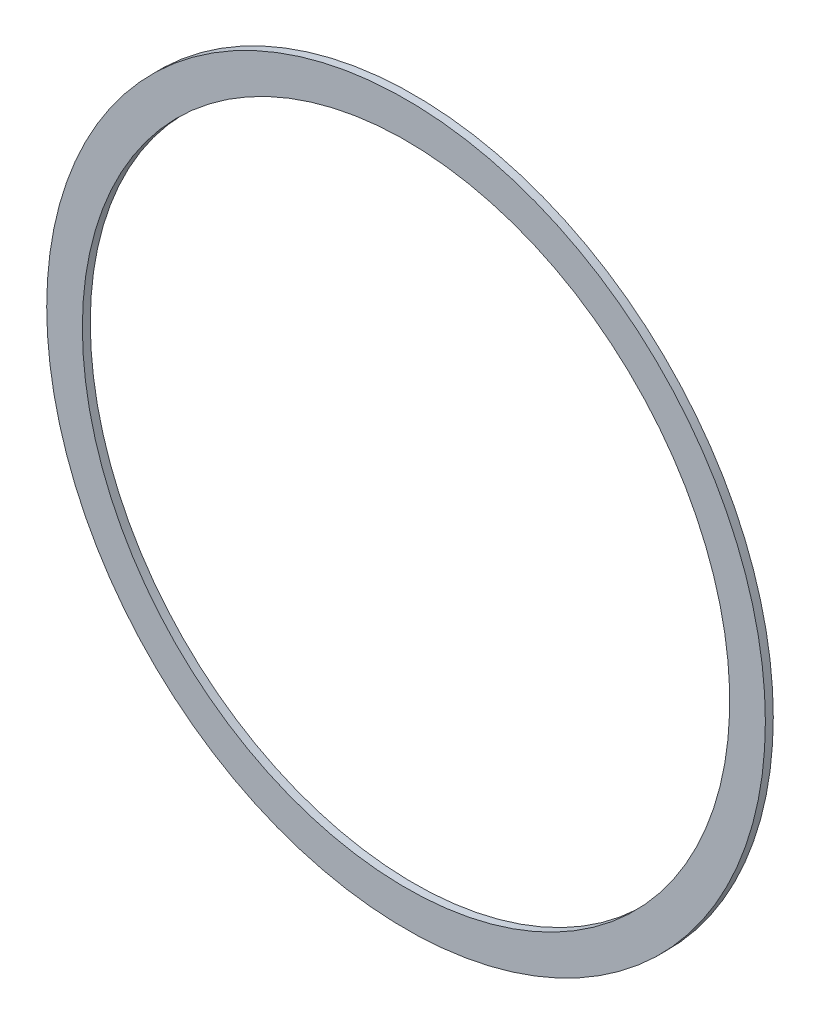
ISO-10303-21;
HEADER;
FILE_DESCRIPTION(('STEP AP214'),'2;1');
FILE_NAME('part.step','',(''),(''),'','','');
FILE_SCHEMA(('AUTOMOTIVE_DESIGN { 1 0 10303 214 1 1 1 1 }'));
ENDSEC;
DATA;
#1=APPLICATION_CONTEXT('core data for automotive mechanical design processes');
#2=APPLICATION_PROTOCOL_DEFINITION('international standard','automotive_design',2000,#1);
#3=PRODUCT_CONTEXT('',#1,'mechanical');
#4=PRODUCT('Part','Part','',(#3));
#5=PRODUCT_RELATED_PRODUCT_CATEGORY('part','',(#4));
#6=PRODUCT_DEFINITION_FORMATION('','',#4);
#7=PRODUCT_DEFINITION_CONTEXT('part definition',#1,'design');
#8=PRODUCT_DEFINITION('design','',#6,#7);
#9=PRODUCT_DEFINITION_SHAPE('','',#8);
#10=(LENGTH_UNIT() NAMED_UNIT(*) SI_UNIT(.MILLI.,.METRE.));
#11=(NAMED_UNIT(*) PLANE_ANGLE_UNIT() SI_UNIT($,.RADIAN.));
#12=(NAMED_UNIT(*) SI_UNIT($,.STERADIAN.) SOLID_ANGLE_UNIT());
#13=UNCERTAINTY_MEASURE_WITH_UNIT(LENGTH_MEASURE(1.E-05),#10,'distance_accuracy_value','');
#14=(GEOMETRIC_REPRESENTATION_CONTEXT(3) GLOBAL_UNCERTAINTY_ASSIGNED_CONTEXT((#13)) GLOBAL_UNIT_ASSIGNED_CONTEXT((#10,
#11,#12)) REPRESENTATION_CONTEXT('',''));
#15=CARTESIAN_POINT('',(0.,0.,0.));
#16=DIRECTION('',(0.,0.,1.));
#17=DIRECTION('',(1.,0.,0.));
#18=AXIS2_PLACEMENT_3D('',#15,#16,#17);
#19=CARTESIAN_POINT('',(0.,0.,-0.175));
#20=DIRECTION('',(0.,0.,1.));
#21=DIRECTION('',(1.,0.,0.));
#22=AXIS2_PLACEMENT_3D('',#19,#20,#21);
#23=PLANE('',#22);
#24=CARTESIAN_POINT('',(0.,0.,-0.175));
#25=DIRECTION('',(0.,0.,-1.));
#26=DIRECTION('',(-1.,0.,0.));
#27=AXIS2_PLACEMENT_3D('',#24,#25,#26);
#28=CIRCLE('',#27,14.3002);
#29=CARTESIAN_POINT('',(-14.3002,0.,-0.175));
#30=VERTEX_POINT('',#29);
#31=EDGE_CURVE('E27',#30,#30,#28,.F.);
#32=ORIENTED_EDGE('',*,*,#31,.T.);
#33=EDGE_LOOP('',(#32));
#34=FACE_BOUND('',#33,.T.);
#35=CARTESIAN_POINT('',(0.,0.,-0.175));
#36=DIRECTION('',(0.,0.,-1.));
#37=DIRECTION('',(-1.,0.,0.));
#38=AXIS2_PLACEMENT_3D('',#35,#36,#37);
#39=CIRCLE('',#38,15.875);
#40=CARTESIAN_POINT('',(-15.875,0.,-0.175));
#41=VERTEX_POINT('',#40);
#42=EDGE_CURVE('E18',#41,#41,#39,.F.);
#43=ORIENTED_EDGE('',*,*,#42,.F.);
#44=EDGE_LOOP('',(#43));
#45=FACE_BOUND('',#44,.T.);
#46=ADVANCED_FACE('F15',(#34,#45),#23,.F.);
#47=CARTESIAN_POINT('',(0.,0.,0.175));
#48=DIRECTION('',(0.,0.,-1.));
#49=DIRECTION('',(-1.,0.,0.));
#50=AXIS2_PLACEMENT_3D('',#47,#48,#49);
#51=CYLINDRICAL_SURFACE('',#50,15.875);
#52=ORIENTED_EDGE('',*,*,#42,.T.);
#53=EDGE_LOOP('',(#52));
#54=FACE_BOUND('',#53,.T.);
#55=CARTESIAN_POINT('',(0.,0.,0.175));
#56=DIRECTION('',(0.,0.,-1.));
#57=DIRECTION('',(-1.,0.,0.));
#58=AXIS2_PLACEMENT_3D('',#55,#56,#57);
#59=CIRCLE('',#58,15.875);
#60=CARTESIAN_POINT('',(-15.875,0.,0.175));
#61=VERTEX_POINT('',#60);
#62=EDGE_CURVE('E22',#61,#61,#59,.F.);
#63=ORIENTED_EDGE('',*,*,#62,.F.);
#64=EDGE_LOOP('',(#63));
#65=FACE_BOUND('',#64,.T.);
#66=ADVANCED_FACE('F35',(#54,#65),#51,.T.);
#67=CARTESIAN_POINT('',(0.,0.,0.175));
#68=DIRECTION('',(0.,0.,-1.));
#69=DIRECTION('',(-1.,0.,0.));
#70=AXIS2_PLACEMENT_3D('',#67,#68,#69);
#71=CYLINDRICAL_SURFACE('',#70,14.3002);
#72=CARTESIAN_POINT('',(0.,0.,0.175));
#73=DIRECTION('',(0.,0.,-1.));
#74=DIRECTION('',(-1.,0.,0.));
#75=AXIS2_PLACEMENT_3D('',#72,#73,#74);
#76=CIRCLE('',#75,14.3002);
#77=CARTESIAN_POINT('',(-14.3002,0.,0.175));
#78=VERTEX_POINT('',#77);
#79=EDGE_CURVE('E10',#78,#78,#76,.T.);
#80=ORIENTED_EDGE('',*,*,#79,.F.);
#81=EDGE_LOOP('',(#80));
#82=FACE_BOUND('',#81,.T.);
#83=ORIENTED_EDGE('',*,*,#31,.F.);
#84=EDGE_LOOP('',(#83));
#85=FACE_BOUND('',#84,.T.);
#86=ADVANCED_FACE('F43',(#82,#85),#71,.F.);
#87=CARTESIAN_POINT('',(0.,0.,0.175));
#88=DIRECTION('',(0.,0.,1.));
#89=DIRECTION('',(1.,0.,0.));
#90=AXIS2_PLACEMENT_3D('',#87,#88,#89);
#91=PLANE('',#90);
#92=ORIENTED_EDGE('',*,*,#79,.T.);
#93=EDGE_LOOP('',(#92));
#94=FACE_BOUND('',#93,.T.);
#95=ORIENTED_EDGE('',*,*,#62,.T.);
#96=EDGE_LOOP('',(#95));
#97=FACE_BOUND('',#96,.T.);
#98=ADVANCED_FACE('F44',(#94,#97),#91,.T.);
#99=CLOSED_SHELL('',(#46,#66,#86,#98));
#100=MANIFOLD_SOLID_BREP('B1',#99);
#101=ADVANCED_BREP_SHAPE_REPRESENTATION('',(#18,#100),#14);
#102=SHAPE_DEFINITION_REPRESENTATION(#9,#101);
ENDSEC;
END-ISO-10303-21;
